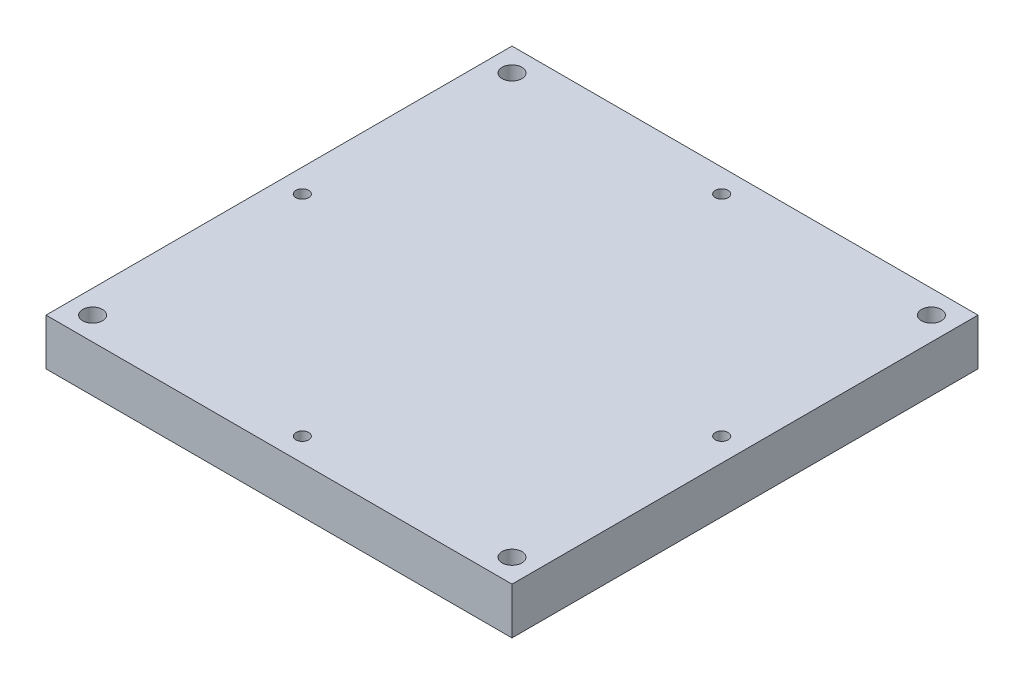
ISO-10303-21;
HEADER;
FILE_DESCRIPTION(('STEP AP214'),'2;1');
FILE_NAME('part.step','',(''),(''),'','','');
FILE_SCHEMA(('AUTOMOTIVE_DESIGN { 1 0 10303 214 1 1 1 1 }'));
ENDSEC;
DATA;
#1=APPLICATION_CONTEXT('core data for automotive mechanical design processes');
#2=APPLICATION_PROTOCOL_DEFINITION('international standard','automotive_design',2000,#1);
#3=PRODUCT_CONTEXT('',#1,'mechanical');
#4=PRODUCT('Part','Part','',(#3));
#5=PRODUCT_RELATED_PRODUCT_CATEGORY('part','',(#4));
#6=PRODUCT_DEFINITION_FORMATION('','',#4);
#7=PRODUCT_DEFINITION_CONTEXT('part definition',#1,'design');
#8=PRODUCT_DEFINITION('design','',#6,#7);
#9=PRODUCT_DEFINITION_SHAPE('','',#8);
#10=(LENGTH_UNIT() NAMED_UNIT(*) SI_UNIT(.MILLI.,.METRE.));
#11=(NAMED_UNIT(*) PLANE_ANGLE_UNIT() SI_UNIT($,.RADIAN.));
#12=(NAMED_UNIT(*) SI_UNIT($,.STERADIAN.) SOLID_ANGLE_UNIT());
#13=UNCERTAINTY_MEASURE_WITH_UNIT(LENGTH_MEASURE(1.E-05),#10,'distance_accuracy_value','');
#14=(GEOMETRIC_REPRESENTATION_CONTEXT(3) GLOBAL_UNCERTAINTY_ASSIGNED_CONTEXT((#13)) GLOBAL_UNIT_ASSIGNED_CONTEXT((#10,
#11,#12)) REPRESENTATION_CONTEXT('',''));
#15=CARTESIAN_POINT('',(0.,0.,0.));
#16=DIRECTION('',(0.,0.,1.));
#17=DIRECTION('',(1.,0.,0.));
#18=AXIS2_PLACEMENT_3D('',#15,#16,#17);
#19=CARTESIAN_POINT('',(0.,20.,0.));
#20=DIRECTION('',(1.,0.,0.));
#21=DIRECTION('',(0.,0.,-1.));
#22=AXIS2_PLACEMENT_3D('',#19,#20,#21);
#23=PLANE('',#22);
#24=DIRECTION('',(0.,0.,1.));
#25=VECTOR('',#24,1.);
#26=CARTESIAN_POINT('',(0.,0.,0.));
#27=LINE('',#26,#25);
#28=CARTESIAN_POINT('',(0.,0.,-200.));
#29=VERTEX_POINT('',#28);
#30=CARTESIAN_POINT('',(0.,0.,0.));
#31=VERTEX_POINT('',#30);
#32=EDGE_CURVE('E113',#29,#31,#27,.T.);
#33=ORIENTED_EDGE('',*,*,#32,.T.);
#34=DIRECTION('',(0.,-1.,0.));
#35=VECTOR('',#34,1.);
#36=CARTESIAN_POINT('',(0.,20.,0.));
#37=LINE('',#36,#35);
#38=CARTESIAN_POINT('',(0.,20.,0.));
#39=VERTEX_POINT('',#38);
#40=EDGE_CURVE('E11',#39,#31,#37,.T.);
#41=ORIENTED_EDGE('',*,*,#40,.F.);
#42=DIRECTION('',(0.,0.,1.));
#43=VECTOR('',#42,1.);
#44=CARTESIAN_POINT('',(0.,20.,0.));
#45=LINE('',#44,#43);
#46=CARTESIAN_POINT('',(0.,20.,-200.));
#47=VERTEX_POINT('',#46);
#48=EDGE_CURVE('E97',#47,#39,#45,.T.);
#49=ORIENTED_EDGE('',*,*,#48,.F.);
#50=DIRECTION('',(0.,-1.,0.));
#51=VECTOR('',#50,1.);
#52=CARTESIAN_POINT('',(0.,20.,-200.));
#53=LINE('',#52,#51);
#54=EDGE_CURVE('E109',#47,#29,#53,.T.);
#55=ORIENTED_EDGE('',*,*,#54,.T.);
#56=EDGE_LOOP('',(#33,#41,#49,#55));
#57=FACE_BOUND('',#56,.T.);
#58=ADVANCED_FACE('F45',(#57),#23,.F.);
#59=CARTESIAN_POINT('',(0.,20.,0.));
#60=DIRECTION('',(0.,0.,-1.));
#61=DIRECTION('',(-1.,0.,0.));
#62=AXIS2_PLACEMENT_3D('',#59,#60,#61);
#63=PLANE('',#62);
#64=DIRECTION('',(1.,0.,0.));
#65=VECTOR('',#64,1.);
#66=CARTESIAN_POINT('',(0.,0.,0.));
#67=LINE('',#66,#65);
#68=CARTESIAN_POINT('',(200.,0.,0.));
#69=VERTEX_POINT('',#68);
#70=EDGE_CURVE('E102',#31,#69,#67,.T.);
#71=ORIENTED_EDGE('',*,*,#70,.T.);
#72=DIRECTION('',(0.,-1.,0.));
#73=VECTOR('',#72,1.);
#74=CARTESIAN_POINT('',(200.,20.,0.));
#75=LINE('',#74,#73);
#76=CARTESIAN_POINT('',(200.,20.,0.));
#77=VERTEX_POINT('',#76);
#78=EDGE_CURVE('E54',#77,#69,#75,.T.);
#79=ORIENTED_EDGE('',*,*,#78,.F.);
#80=DIRECTION('',(1.,0.,0.));
#81=VECTOR('',#80,1.);
#82=CARTESIAN_POINT('',(0.,20.,0.));
#83=LINE('',#82,#81);
#84=EDGE_CURVE('E92',#39,#77,#83,.T.);
#85=ORIENTED_EDGE('',*,*,#84,.F.);
#86=ORIENTED_EDGE('',*,*,#40,.T.);
#87=EDGE_LOOP('',(#71,#79,#85,#86));
#88=FACE_BOUND('',#87,.T.);
#89=ADVANCED_FACE('F101',(#88),#63,.F.);
#90=CARTESIAN_POINT('',(200.,20.,0.));
#91=DIRECTION('',(-1.,0.,0.));
#92=DIRECTION('',(0.,0.,1.));
#93=AXIS2_PLACEMENT_3D('',#90,#91,#92);
#94=PLANE('',#93);
#95=DIRECTION('',(0.,0.,-1.));
#96=VECTOR('',#95,1.);
#97=CARTESIAN_POINT('',(200.,0.,0.));
#98=LINE('',#97,#96);
#99=CARTESIAN_POINT('',(200.,0.,-200.));
#100=VERTEX_POINT('',#99);
#101=EDGE_CURVE('E79',#69,#100,#98,.T.);
#102=ORIENTED_EDGE('',*,*,#101,.T.);
#103=DIRECTION('',(0.,-1.,0.));
#104=VECTOR('',#103,1.);
#105=CARTESIAN_POINT('',(200.,20.,-200.));
#106=LINE('',#105,#104);
#107=CARTESIAN_POINT('',(200.,20.,-200.));
#108=VERTEX_POINT('',#107);
#109=EDGE_CURVE('E104',#108,#100,#106,.T.);
#110=ORIENTED_EDGE('',*,*,#109,.F.);
#111=DIRECTION('',(0.,0.,-1.));
#112=VECTOR('',#111,1.);
#113=CARTESIAN_POINT('',(200.,20.,0.));
#114=LINE('',#113,#112);
#115=EDGE_CURVE('E95',#77,#108,#114,.T.);
#116=ORIENTED_EDGE('',*,*,#115,.F.);
#117=ORIENTED_EDGE('',*,*,#78,.T.);
#118=EDGE_LOOP('',(#102,#110,#116,#117));
#119=FACE_BOUND('',#118,.T.);
#120=ADVANCED_FACE('F105',(#119),#94,.F.);
#121=CARTESIAN_POINT('',(0.,20.,-200.));
#122=DIRECTION('',(0.,0.,1.));
#123=DIRECTION('',(1.,0.,0.));
#124=AXIS2_PLACEMENT_3D('',#121,#122,#123);
#125=PLANE('',#124);
#126=DIRECTION('',(-1.,0.,0.));
#127=VECTOR('',#126,1.);
#128=CARTESIAN_POINT('',(0.,0.,-200.));
#129=LINE('',#128,#127);
#130=EDGE_CURVE('E85',#100,#29,#129,.T.);
#131=ORIENTED_EDGE('',*,*,#130,.T.);
#132=ORIENTED_EDGE('',*,*,#54,.F.);
#133=DIRECTION('',(-1.,0.,0.));
#134=VECTOR('',#133,1.);
#135=CARTESIAN_POINT('',(0.,20.,-200.));
#136=LINE('',#135,#134);
#137=EDGE_CURVE('E62',#108,#47,#136,.T.);
#138=ORIENTED_EDGE('',*,*,#137,.F.);
#139=ORIENTED_EDGE('',*,*,#109,.T.);
#140=EDGE_LOOP('',(#131,#132,#138,#139));
#141=FACE_BOUND('',#140,.T.);
#142=ADVANCED_FACE('F127',(#141),#125,.F.);
#143=CARTESIAN_POINT('',(0.,20.,0.));
#144=DIRECTION('',(0.,-1.,0.));
#145=DIRECTION('',(0.,0.,-1.));
#146=AXIS2_PLACEMENT_3D('',#143,#144,#145);
#147=PLANE('',#146);
#148=CARTESIAN_POINT('',(190.,20.,-10.));
#149=DIRECTION('',(0.,1.,0.));
#150=DIRECTION('',(0.,0.,1.));
#151=AXIS2_PLACEMENT_3D('',#148,#149,#150);
#152=CIRCLE('',#151,4.25000000000001);
#153=CARTESIAN_POINT('',(190.,20.,-5.75));
#154=VERTEX_POINT('',#153);
#155=EDGE_CURVE('E138',#154,#154,#152,.T.);
#156=ORIENTED_EDGE('',*,*,#155,.F.);
#157=EDGE_LOOP('',(#156));
#158=FACE_BOUND('',#157,.T.);
#159=CARTESIAN_POINT('',(189.999999999999,20.,-190.));
#160=DIRECTION('',(0.,1.,0.));
#161=DIRECTION('',(0.,0.,1.));
#162=AXIS2_PLACEMENT_3D('',#159,#160,#161);
#163=CIRCLE('',#162,4.25000000000001);
#164=CARTESIAN_POINT('',(189.999999999999,20.,-185.75));
#165=VERTEX_POINT('',#164);
#166=EDGE_CURVE('E163',#165,#165,#163,.T.);
#167=ORIENTED_EDGE('',*,*,#166,.F.);
#168=EDGE_LOOP('',(#167));
#169=FACE_BOUND('',#168,.T.);
#170=CARTESIAN_POINT('',(9.99999999999938,20.,-190.));
#171=DIRECTION('',(0.,1.,0.));
#172=DIRECTION('',(0.,0.,1.));
#173=AXIS2_PLACEMENT_3D('',#170,#171,#172);
#174=CIRCLE('',#173,4.25);
#175=CARTESIAN_POINT('',(9.99999999999938,20.,-185.75));
#176=VERTEX_POINT('',#175);
#177=EDGE_CURVE('E155',#176,#176,#174,.T.);
#178=ORIENTED_EDGE('',*,*,#177,.F.);
#179=EDGE_LOOP('',(#178));
#180=FACE_BOUND('',#179,.T.);
#181=CARTESIAN_POINT('',(100.,20.,-10.));
#182=DIRECTION('',(0.,1.,0.));
#183=DIRECTION('',(0.,0.,1.));
#184=AXIS2_PLACEMENT_3D('',#181,#182,#183);
#185=CIRCLE('',#184,2.75000000000001);
#186=CARTESIAN_POINT('',(100.,20.,-7.25));
#187=VERTEX_POINT('',#186);
#188=EDGE_CURVE('E146',#187,#187,#185,.T.);
#189=ORIENTED_EDGE('',*,*,#188,.F.);
#190=EDGE_LOOP('',(#189));
#191=FACE_BOUND('',#190,.T.);
#192=CARTESIAN_POINT('',(10.,20.,-100.));
#193=DIRECTION('',(0.,1.,0.));
#194=DIRECTION('',(0.,0.,1.));
#195=AXIS2_PLACEMENT_3D('',#192,#193,#194);
#196=CIRCLE('',#195,2.75);
#197=CARTESIAN_POINT('',(10.,20.,-97.25));
#198=VERTEX_POINT('',#197);
#199=EDGE_CURVE('E147',#198,#198,#196,.T.);
#200=ORIENTED_EDGE('',*,*,#199,.F.);
#201=EDGE_LOOP('',(#200));
#202=FACE_BOUND('',#201,.T.);
#203=CARTESIAN_POINT('',(190.,20.,-100.));
#204=DIRECTION('',(0.,1.,0.));
#205=DIRECTION('',(0.,0.,1.));
#206=AXIS2_PLACEMENT_3D('',#203,#204,#205);
#207=CIRCLE('',#206,2.74999999999998);
#208=CARTESIAN_POINT('',(190.,20.,-97.25));
#209=VERTEX_POINT('',#208);
#210=EDGE_CURVE('E186',#209,#209,#207,.T.);
#211=ORIENTED_EDGE('',*,*,#210,.F.);
#212=EDGE_LOOP('',(#211));
#213=FACE_BOUND('',#212,.T.);
#214=CARTESIAN_POINT('',(99.9999999999997,20.,-190.));
#215=DIRECTION('',(0.,1.,0.));
#216=DIRECTION('',(0.,0.,1.));
#217=AXIS2_PLACEMENT_3D('',#214,#215,#216);
#218=CIRCLE('',#217,2.75000000000001);
#219=CARTESIAN_POINT('',(99.9999999999997,20.,-187.25));
#220=VERTEX_POINT('',#219);
#221=EDGE_CURVE('E178',#220,#220,#218,.T.);
#222=ORIENTED_EDGE('',*,*,#221,.F.);
#223=EDGE_LOOP('',(#222));
#224=FACE_BOUND('',#223,.T.);
#225=CARTESIAN_POINT('',(10.,20.,-10.));
#226=DIRECTION('',(0.,1.,0.));
#227=DIRECTION('',(0.,0.,1.));
#228=AXIS2_PLACEMENT_3D('',#225,#226,#227);
#229=CIRCLE('',#228,4.25);
#230=CARTESIAN_POINT('',(10.,20.,-5.75000000000001));
#231=VERTEX_POINT('',#230);
#232=EDGE_CURVE('E134',#231,#231,#229,.T.);
#233=ORIENTED_EDGE('',*,*,#232,.F.);
#234=EDGE_LOOP('',(#233));
#235=FACE_BOUND('',#234,.T.);
#236=ORIENTED_EDGE('',*,*,#48,.T.);
#237=ORIENTED_EDGE('',*,*,#84,.T.);
#238=ORIENTED_EDGE('',*,*,#115,.T.);
#239=ORIENTED_EDGE('',*,*,#137,.T.);
#240=EDGE_LOOP('',(#236,#237,#238,#239));
#241=FACE_BOUND('',#240,.T.);
#242=ADVANCED_FACE('F93',(#158,#169,#180,#191,#202,#213,#224,#235,#241),#147,.F.);
#243=CARTESIAN_POINT('',(0.,0.,0.));
#244=DIRECTION('',(0.,-1.,0.));
#245=DIRECTION('',(0.,0.,-1.));
#246=AXIS2_PLACEMENT_3D('',#243,#244,#245);
#247=PLANE('',#246);
#248=CARTESIAN_POINT('',(190.,0.,-10.));
#249=DIRECTION('',(0.,1.,0.));
#250=DIRECTION('',(0.,0.,1.));
#251=AXIS2_PLACEMENT_3D('',#248,#249,#250);
#252=CIRCLE('',#251,4.25000000000001);
#253=CARTESIAN_POINT('',(190.,0.,-5.75));
#254=VERTEX_POINT('',#253);
#255=EDGE_CURVE('E167',#254,#254,#252,.T.);
#256=ORIENTED_EDGE('',*,*,#255,.T.);
#257=EDGE_LOOP('',(#256));
#258=FACE_BOUND('',#257,.T.);
#259=CARTESIAN_POINT('',(189.999999999999,0.,-190.));
#260=DIRECTION('',(0.,1.,0.));
#261=DIRECTION('',(0.,0.,1.));
#262=AXIS2_PLACEMENT_3D('',#259,#260,#261);
#263=CIRCLE('',#262,4.25000000000001);
#264=CARTESIAN_POINT('',(189.999999999999,0.,-185.75));
#265=VERTEX_POINT('',#264);
#266=EDGE_CURVE('E159',#265,#265,#263,.T.);
#267=ORIENTED_EDGE('',*,*,#266,.T.);
#268=EDGE_LOOP('',(#267));
#269=FACE_BOUND('',#268,.T.);
#270=CARTESIAN_POINT('',(9.99999999999938,0.,-190.));
#271=DIRECTION('',(0.,1.,0.));
#272=DIRECTION('',(0.,0.,1.));
#273=AXIS2_PLACEMENT_3D('',#270,#271,#272);
#274=CIRCLE('',#273,4.25);
#275=CARTESIAN_POINT('',(9.99999999999938,0.,-185.75));
#276=VERTEX_POINT('',#275);
#277=EDGE_CURVE('E151',#276,#276,#274,.T.);
#278=ORIENTED_EDGE('',*,*,#277,.T.);
#279=EDGE_LOOP('',(#278));
#280=FACE_BOUND('',#279,.T.);
#281=CARTESIAN_POINT('',(100.,0.,-10.));
#282=DIRECTION('',(0.,1.,0.));
#283=DIRECTION('',(0.,0.,1.));
#284=AXIS2_PLACEMENT_3D('',#281,#282,#283);
#285=CIRCLE('',#284,2.75000000000001);
#286=CARTESIAN_POINT('',(100.,0.,-7.25));
#287=VERTEX_POINT('',#286);
#288=EDGE_CURVE('E142',#287,#287,#285,.T.);
#289=ORIENTED_EDGE('',*,*,#288,.T.);
#290=EDGE_LOOP('',(#289));
#291=FACE_BOUND('',#290,.T.);
#292=CARTESIAN_POINT('',(10.,0.,-100.));
#293=DIRECTION('',(0.,1.,0.));
#294=DIRECTION('',(0.,0.,1.));
#295=AXIS2_PLACEMENT_3D('',#292,#293,#294);
#296=CIRCLE('',#295,2.75);
#297=CARTESIAN_POINT('',(10.,0.,-97.25));
#298=VERTEX_POINT('',#297);
#299=EDGE_CURVE('E190',#298,#298,#296,.T.);
#300=ORIENTED_EDGE('',*,*,#299,.T.);
#301=EDGE_LOOP('',(#300));
#302=FACE_BOUND('',#301,.T.);
#303=CARTESIAN_POINT('',(190.,0.,-100.));
#304=DIRECTION('',(0.,1.,0.));
#305=DIRECTION('',(0.,0.,1.));
#306=AXIS2_PLACEMENT_3D('',#303,#304,#305);
#307=CIRCLE('',#306,2.74999999999998);
#308=CARTESIAN_POINT('',(190.,0.,-97.25));
#309=VERTEX_POINT('',#308);
#310=EDGE_CURVE('E182',#309,#309,#307,.T.);
#311=ORIENTED_EDGE('',*,*,#310,.T.);
#312=EDGE_LOOP('',(#311));
#313=FACE_BOUND('',#312,.T.);
#314=CARTESIAN_POINT('',(99.9999999999997,0.,-190.));
#315=DIRECTION('',(0.,1.,0.));
#316=DIRECTION('',(0.,0.,1.));
#317=AXIS2_PLACEMENT_3D('',#314,#315,#316);
#318=CIRCLE('',#317,2.75000000000001);
#319=CARTESIAN_POINT('',(99.9999999999997,0.,-187.25));
#320=VERTEX_POINT('',#319);
#321=EDGE_CURVE('E174',#320,#320,#318,.T.);
#322=ORIENTED_EDGE('',*,*,#321,.T.);
#323=EDGE_LOOP('',(#322));
#324=FACE_BOUND('',#323,.T.);
#325=CARTESIAN_POINT('',(10.,0.,-10.));
#326=DIRECTION('',(0.,1.,0.));
#327=DIRECTION('',(0.,0.,1.));
#328=AXIS2_PLACEMENT_3D('',#325,#326,#327);
#329=CIRCLE('',#328,4.25);
#330=CARTESIAN_POINT('',(10.,0.,-5.75000000000001));
#331=VERTEX_POINT('',#330);
#332=EDGE_CURVE('E117',#331,#331,#329,.T.);
#333=ORIENTED_EDGE('',*,*,#332,.T.);
#334=EDGE_LOOP('',(#333));
#335=FACE_BOUND('',#334,.T.);
#336=ORIENTED_EDGE('',*,*,#32,.F.);
#337=ORIENTED_EDGE('',*,*,#130,.F.);
#338=ORIENTED_EDGE('',*,*,#101,.F.);
#339=ORIENTED_EDGE('',*,*,#70,.F.);
#340=EDGE_LOOP('',(#336,#337,#338,#339));
#341=FACE_BOUND('',#340,.T.);
#342=ADVANCED_FACE('F130',(#258,#269,#280,#291,#302,#313,#324,#335,#341),#247,.T.);
#343=CARTESIAN_POINT('',(10.,0.,-10.));
#344=DIRECTION('',(0.,1.,0.));
#345=DIRECTION('',(0.,0.,1.));
#346=AXIS2_PLACEMENT_3D('',#343,#344,#345);
#347=CYLINDRICAL_SURFACE('',#346,4.25);
#348=ORIENTED_EDGE('',*,*,#332,.F.);
#349=EDGE_LOOP('',(#348));
#350=FACE_BOUND('',#349,.T.);
#351=ORIENTED_EDGE('',*,*,#232,.T.);
#352=EDGE_LOOP('',(#351));
#353=FACE_BOUND('',#352,.T.);
#354=ADVANCED_FACE('F210',(#350,#353),#347,.F.);
#355=CARTESIAN_POINT('',(99.9999999999997,0.,-190.));
#356=DIRECTION('',(0.,1.,0.));
#357=DIRECTION('',(0.,0.,1.));
#358=AXIS2_PLACEMENT_3D('',#355,#356,#357);
#359=CYLINDRICAL_SURFACE('',#358,2.75000000000001);
#360=ORIENTED_EDGE('',*,*,#321,.F.);
#361=EDGE_LOOP('',(#360));
#362=FACE_BOUND('',#361,.T.);
#363=ORIENTED_EDGE('',*,*,#221,.T.);
#364=EDGE_LOOP('',(#363));
#365=FACE_BOUND('',#364,.T.);
#366=ADVANCED_FACE('F212',(#362,#365),#359,.F.);
#367=CARTESIAN_POINT('',(190.,0.,-100.));
#368=DIRECTION('',(0.,1.,0.));
#369=DIRECTION('',(0.,0.,1.));
#370=AXIS2_PLACEMENT_3D('',#367,#368,#369);
#371=CYLINDRICAL_SURFACE('',#370,2.74999999999998);
#372=ORIENTED_EDGE('',*,*,#310,.F.);
#373=EDGE_LOOP('',(#372));
#374=FACE_BOUND('',#373,.T.);
#375=ORIENTED_EDGE('',*,*,#210,.T.);
#376=EDGE_LOOP('',(#375));
#377=FACE_BOUND('',#376,.T.);
#378=ADVANCED_FACE('F219',(#374,#377),#371,.F.);
#379=CARTESIAN_POINT('',(10.,0.,-100.));
#380=DIRECTION('',(0.,1.,0.));
#381=DIRECTION('',(0.,0.,1.));
#382=AXIS2_PLACEMENT_3D('',#379,#380,#381);
#383=CYLINDRICAL_SURFACE('',#382,2.75);
#384=ORIENTED_EDGE('',*,*,#299,.F.);
#385=EDGE_LOOP('',(#384));
#386=FACE_BOUND('',#385,.T.);
#387=ORIENTED_EDGE('',*,*,#199,.T.);
#388=EDGE_LOOP('',(#387));
#389=FACE_BOUND('',#388,.T.);
#390=ADVANCED_FACE('F198',(#386,#389),#383,.F.);
#391=CARTESIAN_POINT('',(100.,0.,-10.));
#392=DIRECTION('',(0.,1.,0.));
#393=DIRECTION('',(0.,0.,1.));
#394=AXIS2_PLACEMENT_3D('',#391,#392,#393);
#395=CYLINDRICAL_SURFACE('',#394,2.75000000000001);
#396=ORIENTED_EDGE('',*,*,#288,.F.);
#397=EDGE_LOOP('',(#396));
#398=FACE_BOUND('',#397,.T.);
#399=ORIENTED_EDGE('',*,*,#188,.T.);
#400=EDGE_LOOP('',(#399));
#401=FACE_BOUND('',#400,.T.);
#402=ADVANCED_FACE('F276',(#398,#401),#395,.F.);
#403=CARTESIAN_POINT('',(9.99999999999938,0.,-190.));
#404=DIRECTION('',(0.,1.,0.));
#405=DIRECTION('',(0.,0.,1.));
#406=AXIS2_PLACEMENT_3D('',#403,#404,#405);
#407=CYLINDRICAL_SURFACE('',#406,4.25);
#408=ORIENTED_EDGE('',*,*,#277,.F.);
#409=EDGE_LOOP('',(#408));
#410=FACE_BOUND('',#409,.T.);
#411=ORIENTED_EDGE('',*,*,#177,.T.);
#412=EDGE_LOOP('',(#411));
#413=FACE_BOUND('',#412,.T.);
#414=ADVANCED_FACE('F286',(#410,#413),#407,.F.);
#415=CARTESIAN_POINT('',(189.999999999999,0.,-190.));
#416=DIRECTION('',(0.,1.,0.));
#417=DIRECTION('',(0.,0.,1.));
#418=AXIS2_PLACEMENT_3D('',#415,#416,#417);
#419=CYLINDRICAL_SURFACE('',#418,4.25000000000001);
#420=ORIENTED_EDGE('',*,*,#266,.F.);
#421=EDGE_LOOP('',(#420));
#422=FACE_BOUND('',#421,.T.);
#423=ORIENTED_EDGE('',*,*,#166,.T.);
#424=EDGE_LOOP('',(#423));
#425=FACE_BOUND('',#424,.T.);
#426=ADVANCED_FACE('F295',(#422,#425),#419,.F.);
#427=CARTESIAN_POINT('',(190.,0.,-10.));
#428=DIRECTION('',(0.,1.,0.));
#429=DIRECTION('',(0.,0.,1.));
#430=AXIS2_PLACEMENT_3D('',#427,#428,#429);
#431=CYLINDRICAL_SURFACE('',#430,4.25000000000001);
#432=ORIENTED_EDGE('',*,*,#255,.F.);
#433=EDGE_LOOP('',(#432));
#434=FACE_BOUND('',#433,.T.);
#435=ORIENTED_EDGE('',*,*,#155,.T.);
#436=EDGE_LOOP('',(#435));
#437=FACE_BOUND('',#436,.T.);
#438=ADVANCED_FACE('F305',(#434,#437),#431,.F.);
#439=CLOSED_SHELL('',(#58,#89,#120,#142,#242,#342,#354,#366,#378,#390,#402,#414,#426,#438));
#440=MANIFOLD_SOLID_BREP('B2',#439);
#441=ADVANCED_BREP_SHAPE_REPRESENTATION('',(#18,#440),#14);
#442=SHAPE_DEFINITION_REPRESENTATION(#9,#441);
ENDSEC;
END-ISO-10303-21;
